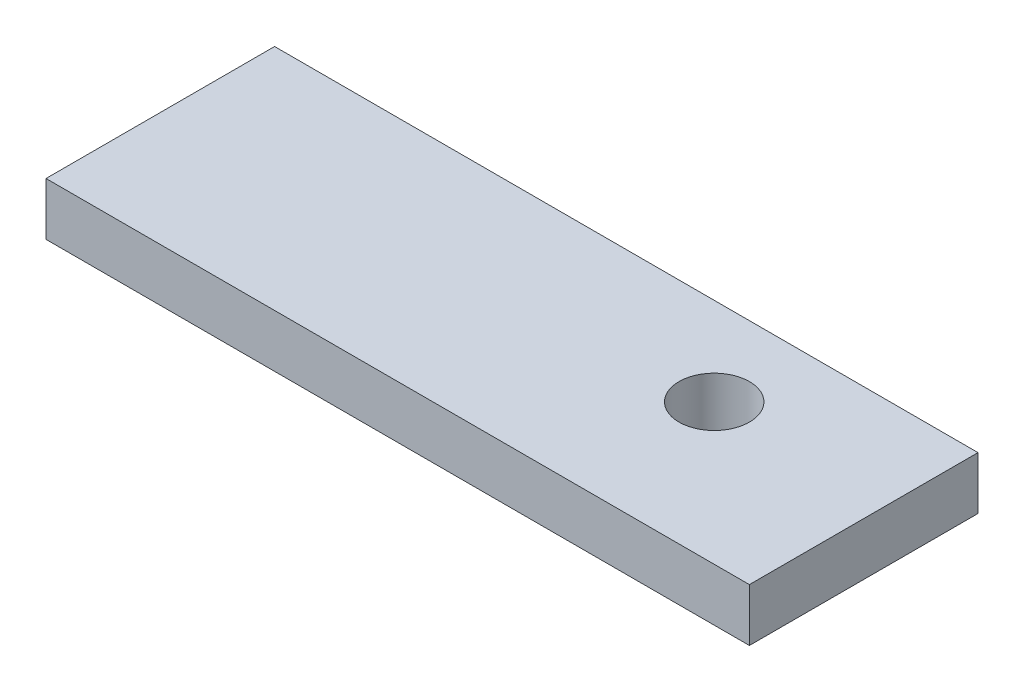
ISO-10303-21;
HEADER;
FILE_DESCRIPTION(('STEP AP214'),'2;1');
FILE_NAME('part.step','',(''),(''),'','','');
FILE_SCHEMA(('AUTOMOTIVE_DESIGN { 1 0 10303 214 1 1 1 1 }'));
ENDSEC;
DATA;
#1=APPLICATION_CONTEXT('core data for automotive mechanical design processes');
#2=APPLICATION_PROTOCOL_DEFINITION('international standard','automotive_design',2000,#1);
#3=PRODUCT_CONTEXT('',#1,'mechanical');
#4=PRODUCT('Part','Part','',(#3));
#5=PRODUCT_RELATED_PRODUCT_CATEGORY('part','',(#4));
#6=PRODUCT_DEFINITION_FORMATION('','',#4);
#7=PRODUCT_DEFINITION_CONTEXT('part definition',#1,'design');
#8=PRODUCT_DEFINITION('design','',#6,#7);
#9=PRODUCT_DEFINITION_SHAPE('','',#8);
#10=(LENGTH_UNIT() NAMED_UNIT(*) SI_UNIT(.MILLI.,.METRE.));
#11=(NAMED_UNIT(*) PLANE_ANGLE_UNIT() SI_UNIT($,.RADIAN.));
#12=(NAMED_UNIT(*) SI_UNIT($,.STERADIAN.) SOLID_ANGLE_UNIT());
#13=UNCERTAINTY_MEASURE_WITH_UNIT(LENGTH_MEASURE(1.E-05),#10,'distance_accuracy_value','');
#14=(GEOMETRIC_REPRESENTATION_CONTEXT(3) GLOBAL_UNCERTAINTY_ASSIGNED_CONTEXT((#13)) GLOBAL_UNIT_ASSIGNED_CONTEXT((#10,
#11,#12)) REPRESENTATION_CONTEXT('',''));
#15=CARTESIAN_POINT('',(0.,0.,0.));
#16=DIRECTION('',(0.,0.,1.));
#17=DIRECTION('',(1.,0.,0.));
#18=AXIS2_PLACEMENT_3D('',#15,#16,#17);
#19=CARTESIAN_POINT('',(1.4035555357999E-13,3.,26.9698226688948));
#20=DIRECTION('',(0.,0.,1.));
#21=DIRECTION('',(1.,0.,0.));
#22=AXIS2_PLACEMENT_3D('',#19,#20,#21);
#23=PLANE('',#22);
#24=DIRECTION('',(-1.,0.,0.));
#25=VECTOR('',#24,1.);
#26=CARTESIAN_POINT('',(1.4035555357999E-13,0.,26.9698226688948));
#27=LINE('',#26,#25);
#28=CARTESIAN_POINT('',(152.296761577573,0.,26.969822668894));
#29=VERTEX_POINT('',#28);
#30=CARTESIAN_POINT('',(112.296761577573,0.,26.9698226688942));
#31=VERTEX_POINT('',#30);
#32=EDGE_CURVE('E104',#29,#31,#27,.T.);
#33=ORIENTED_EDGE('',*,*,#32,.F.);
#34=DIRECTION('',(0.,-1.,0.));
#35=VECTOR('',#34,1.);
#36=CARTESIAN_POINT('',(152.296761577573,3.,26.969822668894));
#37=LINE('',#36,#35);
#38=CARTESIAN_POINT('',(152.296761577573,3.,26.969822668894));
#39=VERTEX_POINT('',#38);
#40=EDGE_CURVE('E11',#39,#29,#37,.T.);
#41=ORIENTED_EDGE('',*,*,#40,.F.);
#42=DIRECTION('',(-1.,0.,0.));
#43=VECTOR('',#42,1.);
#44=CARTESIAN_POINT('',(1.4035555357999E-13,3.,26.9698226688948));
#45=LINE('',#44,#43);
#46=CARTESIAN_POINT('',(112.296761577573,3.,26.9698226688942));
#47=VERTEX_POINT('',#46);
#48=EDGE_CURVE('E86',#39,#47,#45,.T.);
#49=ORIENTED_EDGE('',*,*,#48,.T.);
#50=DIRECTION('',(0.,-1.,0.));
#51=VECTOR('',#50,1.);
#52=CARTESIAN_POINT('',(112.296761577573,3.,26.9698226688942));
#53=LINE('',#52,#51);
#54=EDGE_CURVE('E75',#47,#31,#53,.T.);
#55=ORIENTED_EDGE('',*,*,#54,.T.);
#56=EDGE_LOOP('',(#33,#41,#49,#55));
#57=FACE_BOUND('',#56,.T.);
#58=ADVANCED_FACE('F37',(#57),#23,.T.);
#59=CARTESIAN_POINT('',(152.296761577573,3.,0.));
#60=DIRECTION('',(-1.,0.,0.));
#61=DIRECTION('',(0.,0.,1.));
#62=AXIS2_PLACEMENT_3D('',#59,#60,#61);
#63=PLANE('',#62);
#64=DIRECTION('',(0.,0.,-1.));
#65=VECTOR('',#64,1.);
#66=CARTESIAN_POINT('',(152.296761577573,0.,0.));
#67=LINE('',#66,#65);
#68=CARTESIAN_POINT('',(152.296761577573,0.,13.9698226688942));
#69=VERTEX_POINT('',#68);
#70=EDGE_CURVE('E92',#29,#69,#67,.T.);
#71=ORIENTED_EDGE('',*,*,#70,.T.);
#72=DIRECTION('',(0.,-1.,0.));
#73=VECTOR('',#72,1.);
#74=CARTESIAN_POINT('',(152.296761577573,3.,13.9698226688942));
#75=LINE('',#74,#73);
#76=CARTESIAN_POINT('',(152.296761577573,3.,13.9698226688942));
#77=VERTEX_POINT('',#76);
#78=EDGE_CURVE('E45',#77,#69,#75,.T.);
#79=ORIENTED_EDGE('',*,*,#78,.F.);
#80=DIRECTION('',(0.,0.,-1.));
#81=VECTOR('',#80,1.);
#82=CARTESIAN_POINT('',(152.296761577573,3.,0.));
#83=LINE('',#82,#81);
#84=EDGE_CURVE('E80',#39,#77,#83,.T.);
#85=ORIENTED_EDGE('',*,*,#84,.F.);
#86=ORIENTED_EDGE('',*,*,#40,.T.);
#87=EDGE_LOOP('',(#71,#79,#85,#86));
#88=FACE_BOUND('',#87,.T.);
#89=ADVANCED_FACE('F90',(#88),#63,.F.);
#90=CARTESIAN_POINT('',(0.,3.,13.9698226688943));
#91=DIRECTION('',(0.,0.,-1.));
#92=DIRECTION('',(-1.,0.,0.));
#93=AXIS2_PLACEMENT_3D('',#90,#91,#92);
#94=PLANE('',#93);
#95=DIRECTION('',(1.,0.,0.));
#96=VECTOR('',#95,1.);
#97=CARTESIAN_POINT('',(0.,0.,13.9698226688943));
#98=LINE('',#97,#96);
#99=CARTESIAN_POINT('',(112.296761577573,0.,13.9698226688942));
#100=VERTEX_POINT('',#99);
#101=EDGE_CURVE('E108',#100,#69,#98,.T.);
#102=ORIENTED_EDGE('',*,*,#101,.F.);
#103=DIRECTION('',(0.,-1.,0.));
#104=VECTOR('',#103,1.);
#105=CARTESIAN_POINT('',(112.296761577573,3.,13.9698226688942));
#106=LINE('',#105,#104);
#107=CARTESIAN_POINT('',(112.296761577573,3.,13.9698226688942));
#108=VERTEX_POINT('',#107);
#109=EDGE_CURVE('E68',#108,#100,#106,.T.);
#110=ORIENTED_EDGE('',*,*,#109,.F.);
#111=DIRECTION('',(1.,0.,0.));
#112=VECTOR('',#111,1.);
#113=CARTESIAN_POINT('',(0.,3.,13.9698226688943));
#114=LINE('',#113,#112);
#115=EDGE_CURVE('E85',#108,#77,#114,.T.);
#116=ORIENTED_EDGE('',*,*,#115,.T.);
#117=ORIENTED_EDGE('',*,*,#78,.T.);
#118=EDGE_LOOP('',(#102,#110,#116,#117));
#119=FACE_BOUND('',#118,.T.);
#120=ADVANCED_FACE('F96',(#119),#94,.T.);
#121=CARTESIAN_POINT('',(112.296761577573,3.,3.30325947032491E-13));
#122=DIRECTION('',(1.,0.,0.));
#123=DIRECTION('',(0.,0.,-1.));
#124=AXIS2_PLACEMENT_3D('',#121,#122,#123);
#125=PLANE('',#124);
#126=DIRECTION('',(0.,0.,1.));
#127=VECTOR('',#126,1.);
#128=CARTESIAN_POINT('',(112.296761577573,0.,3.30325947032491E-13));
#129=LINE('',#128,#127);
#130=EDGE_CURVE('E110',#100,#31,#129,.T.);
#131=ORIENTED_EDGE('',*,*,#130,.T.);
#132=ORIENTED_EDGE('',*,*,#54,.F.);
#133=DIRECTION('',(0.,0.,1.));
#134=VECTOR('',#133,1.);
#135=CARTESIAN_POINT('',(112.296761577573,3.,3.30325947032491E-13));
#136=LINE('',#135,#134);
#137=EDGE_CURVE('E53',#108,#47,#136,.T.);
#138=ORIENTED_EDGE('',*,*,#137,.F.);
#139=ORIENTED_EDGE('',*,*,#109,.T.);
#140=EDGE_LOOP('',(#131,#132,#138,#139));
#141=FACE_BOUND('',#140,.T.);
#142=ADVANCED_FACE('F125',(#141),#125,.F.);
#143=CARTESIAN_POINT('',(142.296761577573,3.,18.9698226688939));
#144=DIRECTION('',(0.,-1.,0.));
#145=DIRECTION('',(0.,0.,-1.));
#146=AXIS2_PLACEMENT_3D('',#143,#144,#145);
#147=CYLINDRICAL_SURFACE('',#146,2.);
#148=CARTESIAN_POINT('',(142.296761577573,3.,18.9698226688939));
#149=DIRECTION('',(0.,1.,0.));
#150=DIRECTION('',(0.,0.,1.));
#151=AXIS2_PLACEMENT_3D('',#148,#149,#150);
#152=CIRCLE('',#151,2.);
#153=CARTESIAN_POINT('',(142.296761577573,3.,20.9698226688939));
#154=VERTEX_POINT('',#153);
#155=EDGE_CURVE('E98',#154,#154,#152,.F.);
#156=ORIENTED_EDGE('',*,*,#155,.F.);
#157=EDGE_LOOP('',(#156));
#158=FACE_BOUND('',#157,.T.);
#159=CARTESIAN_POINT('',(142.296761577573,0.,18.9698226688939));
#160=DIRECTION('',(0.,1.,0.));
#161=DIRECTION('',(0.,0.,1.));
#162=AXIS2_PLACEMENT_3D('',#159,#160,#161);
#163=CIRCLE('',#162,2.);
#164=CARTESIAN_POINT('',(142.296761577573,0.,20.9698226688939));
#165=VERTEX_POINT('',#164);
#166=EDGE_CURVE('E112',#165,#165,#163,.F.);
#167=ORIENTED_EDGE('',*,*,#166,.T.);
#168=EDGE_LOOP('',(#167));
#169=FACE_BOUND('',#168,.T.);
#170=ADVANCED_FACE('F130',(#158,#169),#147,.F.);
#171=CARTESIAN_POINT('',(0.,3.,0.));
#172=DIRECTION('',(0.,1.,0.));
#173=DIRECTION('',(0.,0.,1.));
#174=AXIS2_PLACEMENT_3D('',#171,#172,#173);
#175=PLANE('',#174);
#176=ORIENTED_EDGE('',*,*,#48,.F.);
#177=ORIENTED_EDGE('',*,*,#84,.T.);
#178=ORIENTED_EDGE('',*,*,#115,.F.);
#179=ORIENTED_EDGE('',*,*,#137,.T.);
#180=EDGE_LOOP('',(#176,#177,#178,#179));
#181=FACE_BOUND('',#180,.T.);
#182=ORIENTED_EDGE('',*,*,#155,.T.);
#183=EDGE_LOOP('',(#182));
#184=FACE_BOUND('',#183,.T.);
#185=ADVANCED_FACE('F82',(#181,#184),#175,.T.);
#186=CARTESIAN_POINT('',(0.,0.,0.));
#187=DIRECTION('',(0.,1.,0.));
#188=DIRECTION('',(0.,0.,1.));
#189=AXIS2_PLACEMENT_3D('',#186,#187,#188);
#190=PLANE('',#189);
#191=ORIENTED_EDGE('',*,*,#32,.T.);
#192=ORIENTED_EDGE('',*,*,#130,.F.);
#193=ORIENTED_EDGE('',*,*,#101,.T.);
#194=ORIENTED_EDGE('',*,*,#70,.F.);
#195=EDGE_LOOP('',(#191,#192,#193,#194));
#196=FACE_BOUND('',#195,.T.);
#197=ORIENTED_EDGE('',*,*,#166,.F.);
#198=EDGE_LOOP('',(#197));
#199=FACE_BOUND('',#198,.T.);
#200=ADVANCED_FACE('F134',(#196,#199),#190,.F.);
#201=CLOSED_SHELL('',(#58,#89,#120,#142,#170,#185,#200));
#202=MANIFOLD_SOLID_BREP('B2',#201);
#203=ADVANCED_BREP_SHAPE_REPRESENTATION('',(#18,#202),#14);
#204=SHAPE_DEFINITION_REPRESENTATION(#9,#203);
ENDSEC;
END-ISO-10303-21;
